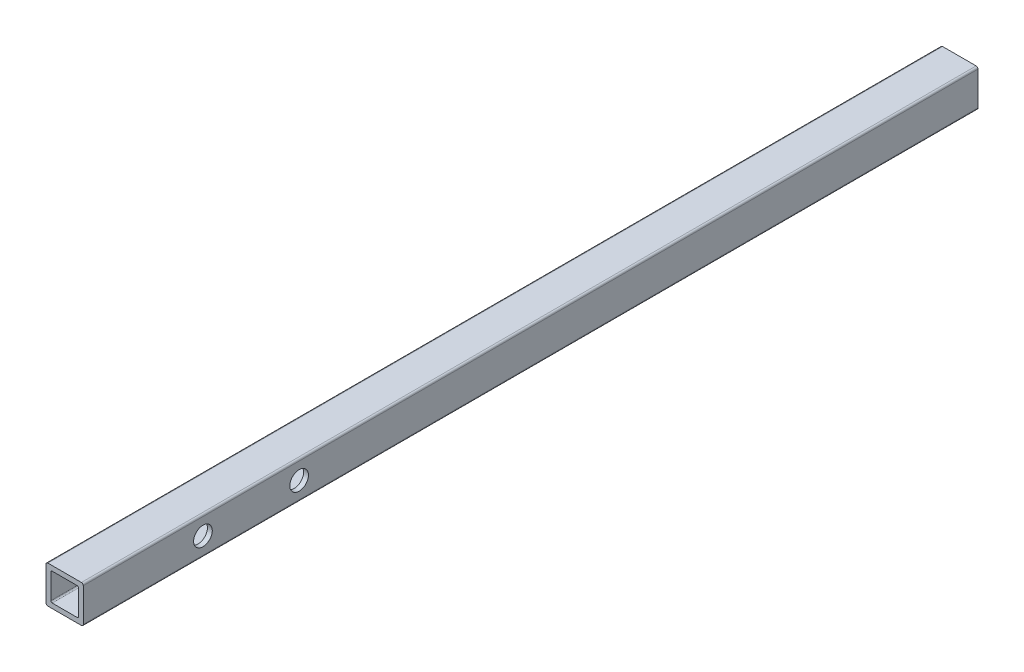
ISO-10303-21;
HEADER;
FILE_DESCRIPTION(('STEP AP214'),'2;1');
FILE_NAME('part.step','',(''),(''),'','','');
FILE_SCHEMA(('AUTOMOTIVE_DESIGN { 1 0 10303 214 1 1 1 1 }'));
ENDSEC;
DATA;
#1=APPLICATION_CONTEXT('core data for automotive mechanical design processes');
#2=APPLICATION_PROTOCOL_DEFINITION('international standard','automotive_design',2000,#1);
#3=PRODUCT_CONTEXT('',#1,'mechanical');
#4=PRODUCT('Part','Part','',(#3));
#5=PRODUCT_RELATED_PRODUCT_CATEGORY('part','',(#4));
#6=PRODUCT_DEFINITION_FORMATION('','',#4);
#7=PRODUCT_DEFINITION_CONTEXT('part definition',#1,'design');
#8=PRODUCT_DEFINITION('design','',#6,#7);
#9=PRODUCT_DEFINITION_SHAPE('','',#8);
#10=(LENGTH_UNIT() NAMED_UNIT(*) SI_UNIT(.MILLI.,.METRE.));
#11=(NAMED_UNIT(*) PLANE_ANGLE_UNIT() SI_UNIT($,.RADIAN.));
#12=(NAMED_UNIT(*) SI_UNIT($,.STERADIAN.) SOLID_ANGLE_UNIT());
#13=UNCERTAINTY_MEASURE_WITH_UNIT(LENGTH_MEASURE(1.E-05),#10,'distance_accuracy_value','');
#14=(GEOMETRIC_REPRESENTATION_CONTEXT(3) GLOBAL_UNCERTAINTY_ASSIGNED_CONTEXT((#13)) GLOBAL_UNIT_ASSIGNED_CONTEXT((#10,
#11,#12)) REPRESENTATION_CONTEXT('',''));
#15=CARTESIAN_POINT('',(0.,0.,0.));
#16=DIRECTION('',(0.,0.,1.));
#17=DIRECTION('',(1.,0.,0.));
#18=AXIS2_PLACEMENT_3D('',#15,#16,#17);
#19=CARTESIAN_POINT('',(5.71499999999997,-5.715,152.4));
#20=DIRECTION('',(0.,0.,1.));
#21=DIRECTION('',(1.,0.,0.));
#22=AXIS2_PLACEMENT_3D('',#19,#20,#21);
#23=PLANE('',#22);
#24=CARTESIAN_POINT('',(5.71499999999997,-5.715,152.4));
#25=DIRECTION('',(0.,0.,1.));
#26=DIRECTION('',(1.,0.,0.));
#27=AXIS2_PLACEMENT_3D('',#24,#25,#26);
#28=CIRCLE('',#27,0.634999999999999);
#29=CARTESIAN_POINT('',(5.71499999999997,-6.34999999999999,152.4));
#30=VERTEX_POINT('',#29);
#31=CARTESIAN_POINT('',(6.34999999999997,-5.715,152.4));
#32=VERTEX_POINT('',#31);
#33=EDGE_CURVE('E160',#30,#32,#28,.T.);
#34=ORIENTED_EDGE('',*,*,#33,.T.);
#35=DIRECTION('',(0.,1.,0.));
#36=VECTOR('',#35,1.);
#37=CARTESIAN_POINT('',(6.34999999999997,-5.715,152.4));
#38=LINE('',#37,#36);
#39=CARTESIAN_POINT('',(6.34999999999997,5.715,152.4));
#40=VERTEX_POINT('',#39);
#41=EDGE_CURVE('E248',#32,#40,#38,.T.);
#42=ORIENTED_EDGE('',*,*,#41,.T.);
#43=CARTESIAN_POINT('',(5.71499999999997,5.715,152.4));
#44=DIRECTION('',(0.,0.,1.));
#45=DIRECTION('',(1.,0.,0.));
#46=AXIS2_PLACEMENT_3D('',#43,#44,#45);
#47=CIRCLE('',#46,0.634999999999999);
#48=CARTESIAN_POINT('',(5.71499999999997,6.34999999999999,152.4));
#49=VERTEX_POINT('',#48);
#50=EDGE_CURVE('E250',#40,#49,#47,.T.);
#51=ORIENTED_EDGE('',*,*,#50,.T.);
#52=DIRECTION('',(-1.,0.,0.));
#53=VECTOR('',#52,1.);
#54=CARTESIAN_POINT('',(5.71499999999997,6.34999999999999,152.4));
#55=LINE('',#54,#53);
#56=CARTESIAN_POINT('',(-5.71500000000003,6.35000000000001,152.4));
#57=VERTEX_POINT('',#56);
#58=EDGE_CURVE('E252',#49,#57,#55,.T.);
#59=ORIENTED_EDGE('',*,*,#58,.T.);
#60=CARTESIAN_POINT('',(-5.71500000000003,5.715,152.4));
#61=DIRECTION('',(0.,0.,1.));
#62=DIRECTION('',(1.,0.,0.));
#63=AXIS2_PLACEMENT_3D('',#60,#61,#62);
#64=CIRCLE('',#63,0.635000000000003);
#65=CARTESIAN_POINT('',(-6.35000000000008,5.715,152.4));
#66=VERTEX_POINT('',#65);
#67=EDGE_CURVE('E254',#57,#66,#64,.T.);
#68=ORIENTED_EDGE('',*,*,#67,.T.);
#69=DIRECTION('',(0.,-1.,0.));
#70=VECTOR('',#69,1.);
#71=CARTESIAN_POINT('',(-6.35000000000008,-5.715,152.4));
#72=LINE('',#71,#70);
#73=CARTESIAN_POINT('',(-6.35000000000008,-5.715,152.4));
#74=VERTEX_POINT('',#73);
#75=EDGE_CURVE('E256',#66,#74,#72,.T.);
#76=ORIENTED_EDGE('',*,*,#75,.T.);
#77=CARTESIAN_POINT('',(-5.71500000000003,-5.715,152.4));
#78=DIRECTION('',(0.,0.,1.));
#79=DIRECTION('',(1.,0.,0.));
#80=AXIS2_PLACEMENT_3D('',#77,#78,#79);
#81=CIRCLE('',#80,0.635000000000003);
#82=CARTESIAN_POINT('',(-5.71500000000003,-6.34999999999999,152.4));
#83=VERTEX_POINT('',#82);
#84=EDGE_CURVE('E258',#74,#83,#81,.T.);
#85=ORIENTED_EDGE('',*,*,#84,.T.);
#86=DIRECTION('',(1.,0.,0.));
#87=VECTOR('',#86,1.);
#88=CARTESIAN_POINT('',(5.71499999999997,-6.34999999999999,152.4));
#89=LINE('',#88,#87);
#90=EDGE_CURVE('E59',#83,#30,#89,.T.);
#91=ORIENTED_EDGE('',*,*,#90,.T.);
#92=EDGE_LOOP('',(#34,#42,#51,#59,#68,#76,#85,#91));
#93=FACE_BOUND('',#92,.T.);
#94=DIRECTION('',(-1.,0.,0.));
#95=VECTOR('',#94,1.);
#96=CARTESIAN_POINT('',(4.22909999999999,4.69899999999999,152.4));
#97=LINE('',#96,#95);
#98=CARTESIAN_POINT('',(4.22909999999999,4.69899999999999,152.4));
#99=VERTEX_POINT('',#98);
#100=CARTESIAN_POINT('',(-4.22910000000004,4.69899999999999,152.4));
#101=VERTEX_POINT('',#100);
#102=EDGE_CURVE('E221',#99,#101,#97,.T.);
#103=ORIENTED_EDGE('',*,*,#102,.F.);
#104=CARTESIAN_POINT('',(4.22909999999999,4.2291,152.4));
#105=DIRECTION('',(0.,0.,1.));
#106=DIRECTION('',(1.,0.,0.));
#107=AXIS2_PLACEMENT_3D('',#104,#105,#106);
#108=CIRCLE('',#107,0.469899999999999);
#109=CARTESIAN_POINT('',(4.69899999999995,4.2291,152.4));
#110=VERTEX_POINT('',#109);
#111=EDGE_CURVE('E157',#110,#99,#108,.T.);
#112=ORIENTED_EDGE('',*,*,#111,.F.);
#113=DIRECTION('',(0.,1.,0.));
#114=VECTOR('',#113,1.);
#115=CARTESIAN_POINT('',(4.69899999999995,4.2291,152.4));
#116=LINE('',#115,#114);
#117=CARTESIAN_POINT('',(4.69899999999995,-4.2291,152.4));
#118=VERTEX_POINT('',#117);
#119=EDGE_CURVE('E233',#118,#110,#116,.T.);
#120=ORIENTED_EDGE('',*,*,#119,.F.);
#121=CARTESIAN_POINT('',(4.22909999999999,-4.2291,152.4));
#122=DIRECTION('',(0.,0.,1.));
#123=DIRECTION('',(1.,0.,0.));
#124=AXIS2_PLACEMENT_3D('',#121,#122,#123);
#125=CIRCLE('',#124,0.469899999999999);
#126=CARTESIAN_POINT('',(4.22909999999999,-4.69899999999999,152.4));
#127=VERTEX_POINT('',#126);
#128=EDGE_CURVE('E231',#127,#118,#125,.T.);
#129=ORIENTED_EDGE('',*,*,#128,.F.);
#130=DIRECTION('',(1.,0.,0.));
#131=VECTOR('',#130,1.);
#132=CARTESIAN_POINT('',(4.22909999999999,-4.69899999999999,152.4));
#133=LINE('',#132,#131);
#134=CARTESIAN_POINT('',(-4.22910000000004,-4.69899999999999,152.4));
#135=VERTEX_POINT('',#134);
#136=EDGE_CURVE('E229',#135,#127,#133,.T.);
#137=ORIENTED_EDGE('',*,*,#136,.F.);
#138=CARTESIAN_POINT('',(-4.22910000000004,-4.2291,152.4));
#139=DIRECTION('',(0.,0.,1.));
#140=DIRECTION('',(1.,0.,0.));
#141=AXIS2_PLACEMENT_3D('',#138,#139,#140);
#142=CIRCLE('',#141,0.4699);
#143=CARTESIAN_POINT('',(-4.69900000000001,-4.2291,152.4));
#144=VERTEX_POINT('',#143);
#145=EDGE_CURVE('E227',#144,#135,#142,.T.);
#146=ORIENTED_EDGE('',*,*,#145,.F.);
#147=DIRECTION('',(0.,-1.,0.));
#148=VECTOR('',#147,1.);
#149=CARTESIAN_POINT('',(-4.69900000000006,4.2291,152.4));
#150=LINE('',#149,#148);
#151=CARTESIAN_POINT('',(-4.69900000000006,4.2291,152.4));
#152=VERTEX_POINT('',#151);
#153=EDGE_CURVE('E225',#152,#144,#150,.T.);
#154=ORIENTED_EDGE('',*,*,#153,.F.);
#155=CARTESIAN_POINT('',(-4.22910000000004,4.2291,152.4));
#156=DIRECTION('',(0.,0.,1.));
#157=DIRECTION('',(1.,0.,0.));
#158=AXIS2_PLACEMENT_3D('',#155,#156,#157);
#159=CIRCLE('',#158,0.4699);
#160=EDGE_CURVE('E223',#101,#152,#159,.T.);
#161=ORIENTED_EDGE('',*,*,#160,.F.);
#162=EDGE_LOOP('',(#103,#112,#120,#129,#137,#146,#154,#161));
#163=FACE_BOUND('',#162,.T.);
#164=ADVANCED_FACE('F34',(#93,#163),#23,.T.);
#165=CARTESIAN_POINT('',(5.71499999999997,-5.715,152.4));
#166=DIRECTION('',(0.,0.,-1.));
#167=DIRECTION('',(-1.,0.,0.));
#168=AXIS2_PLACEMENT_3D('',#165,#166,#167);
#169=CYLINDRICAL_SURFACE('',#168,0.634999999999999);
#170=DIRECTION('',(0.,0.,-1.));
#171=VECTOR('',#170,1.);
#172=CARTESIAN_POINT('',(5.71499999999997,-6.34999999999999,152.4));
#173=LINE('',#172,#171);
#174=CARTESIAN_POINT('',(5.71500000000003,-6.34999999999997,-152.4));
#175=VERTEX_POINT('',#174);
#176=EDGE_CURVE('E261',#30,#175,#173,.T.);
#177=ORIENTED_EDGE('',*,*,#176,.T.);
#178=CARTESIAN_POINT('',(5.71500000000003,-5.71499999999997,-152.4));
#179=DIRECTION('',(0.,0.,1.));
#180=DIRECTION('',(1.,0.,0.));
#181=AXIS2_PLACEMENT_3D('',#178,#179,#180);
#182=CIRCLE('',#181,0.634999999999999);
#183=CARTESIAN_POINT('',(6.35000000000002,-5.71499999999997,-152.4));
#184=VERTEX_POINT('',#183);
#185=EDGE_CURVE('E196',#175,#184,#182,.T.);
#186=ORIENTED_EDGE('',*,*,#185,.T.);
#187=DIRECTION('',(0.,0.,-1.));
#188=VECTOR('',#187,1.);
#189=CARTESIAN_POINT('',(6.34999999999997,-5.715,152.4));
#190=LINE('',#189,#188);
#191=EDGE_CURVE('E11',#32,#184,#190,.T.);
#192=ORIENTED_EDGE('',*,*,#191,.F.);
#193=ORIENTED_EDGE('',*,*,#33,.F.);
#194=EDGE_LOOP('',(#177,#186,#192,#193));
#195=FACE_BOUND('',#194,.T.);
#196=ADVANCED_FACE('F36',(#195),#169,.T.);
#197=CARTESIAN_POINT('',(6.34999999999997,-5.715,152.4));
#198=DIRECTION('',(-1.,0.,0.));
#199=DIRECTION('',(0.,0.,1.));
#200=AXIS2_PLACEMENT_3D('',#197,#198,#199);
#201=PLANE('',#200);
#202=CARTESIAN_POINT('',(6.34999999999997,0.,78.8679589234109));
#203=DIRECTION('',(-1.,0.,0.));
#204=DIRECTION('',(0.,0.,1.));
#205=AXIS2_PLACEMENT_3D('',#202,#203,#204);
#206=CIRCLE('',#205,3.175);
#207=CARTESIAN_POINT('',(6.34999999999997,0.,82.0429589234109));
#208=VERTEX_POINT('',#207);
#209=EDGE_CURVE('E287',#208,#208,#206,.T.);
#210=ORIENTED_EDGE('',*,*,#209,.T.);
#211=EDGE_LOOP('',(#210));
#212=FACE_BOUND('',#211,.T.);
#213=CARTESIAN_POINT('',(6.34999999999997,0.,111.632041076589));
#214=DIRECTION('',(-1.,0.,0.));
#215=DIRECTION('',(0.,0.,1.));
#216=AXIS2_PLACEMENT_3D('',#213,#214,#215);
#217=CIRCLE('',#216,3.175);
#218=CARTESIAN_POINT('',(6.34999999999997,0.,114.807041076589));
#219=VERTEX_POINT('',#218);
#220=EDGE_CURVE('E274',#219,#219,#217,.T.);
#221=ORIENTED_EDGE('',*,*,#220,.T.);
#222=EDGE_LOOP('',(#221));
#223=FACE_BOUND('',#222,.T.);
#224=ORIENTED_EDGE('',*,*,#191,.T.);
#225=DIRECTION('',(0.,1.,0.));
#226=VECTOR('',#225,1.);
#227=CARTESIAN_POINT('',(6.35000000000002,-5.71499999999997,-152.4));
#228=LINE('',#227,#226);
#229=CARTESIAN_POINT('',(6.35000000000002,5.71500000000003,-152.4));
#230=VERTEX_POINT('',#229);
#231=EDGE_CURVE('E199',#184,#230,#228,.T.);
#232=ORIENTED_EDGE('',*,*,#231,.T.);
#233=DIRECTION('',(0.,0.,-1.));
#234=VECTOR('',#233,1.);
#235=CARTESIAN_POINT('',(6.34999999999997,5.715,152.4));
#236=LINE('',#235,#234);
#237=EDGE_CURVE('E43',#40,#230,#236,.T.);
#238=ORIENTED_EDGE('',*,*,#237,.F.);
#239=ORIENTED_EDGE('',*,*,#41,.F.);
#240=EDGE_LOOP('',(#224,#232,#238,#239));
#241=FACE_BOUND('',#240,.T.);
#242=ADVANCED_FACE('F327',(#212,#223,#241),#201,.F.);
#243=CARTESIAN_POINT('',(5.71499999999997,5.715,152.4));
#244=DIRECTION('',(0.,0.,-1.));
#245=DIRECTION('',(-1.,0.,0.));
#246=AXIS2_PLACEMENT_3D('',#243,#244,#245);
#247=CYLINDRICAL_SURFACE('',#246,0.634999999999999);
#248=ORIENTED_EDGE('',*,*,#237,.T.);
#249=CARTESIAN_POINT('',(5.71499999999997,5.71500000000003,-152.4));
#250=DIRECTION('',(0.,0.,1.));
#251=DIRECTION('',(1.,0.,0.));
#252=AXIS2_PLACEMENT_3D('',#249,#250,#251);
#253=CIRCLE('',#252,0.634999999999999);
#254=CARTESIAN_POINT('',(5.71499999999997,6.35000000000002,-152.4));
#255=VERTEX_POINT('',#254);
#256=EDGE_CURVE('E202',#230,#255,#253,.T.);
#257=ORIENTED_EDGE('',*,*,#256,.T.);
#258=DIRECTION('',(0.,0.,-1.));
#259=VECTOR('',#258,1.);
#260=CARTESIAN_POINT('',(5.71499999999997,6.34999999999999,152.4));
#261=LINE('',#260,#259);
#262=EDGE_CURVE('E271',#49,#255,#261,.T.);
#263=ORIENTED_EDGE('',*,*,#262,.F.);
#264=ORIENTED_EDGE('',*,*,#50,.F.);
#265=EDGE_LOOP('',(#248,#257,#263,#264));
#266=FACE_BOUND('',#265,.T.);
#267=ADVANCED_FACE('F323',(#266),#247,.T.);
#268=CARTESIAN_POINT('',(5.71499999999997,6.34999999999999,152.4));
#269=DIRECTION('',(0.,-1.,0.));
#270=DIRECTION('',(1.,0.,0.));
#271=AXIS2_PLACEMENT_3D('',#268,#269,#270);
#272=PLANE('',#271);
#273=ORIENTED_EDGE('',*,*,#262,.T.);
#274=DIRECTION('',(-1.,0.,0.));
#275=VECTOR('',#274,1.);
#276=CARTESIAN_POINT('',(5.71499999999997,6.35000000000002,-152.4));
#277=LINE('',#276,#275);
#278=CARTESIAN_POINT('',(-5.71500000000003,6.35000000000002,-152.4));
#279=VERTEX_POINT('',#278);
#280=EDGE_CURVE('E205',#255,#279,#277,.T.);
#281=ORIENTED_EDGE('',*,*,#280,.T.);
#282=DIRECTION('',(0.,0.,-1.));
#283=VECTOR('',#282,1.);
#284=CARTESIAN_POINT('',(-5.71500000000003,6.35000000000001,152.4));
#285=LINE('',#284,#283);
#286=EDGE_CURVE('E269',#57,#279,#285,.T.);
#287=ORIENTED_EDGE('',*,*,#286,.F.);
#288=ORIENTED_EDGE('',*,*,#58,.F.);
#289=EDGE_LOOP('',(#273,#281,#287,#288));
#290=FACE_BOUND('',#289,.T.);
#291=ADVANCED_FACE('F318',(#290),#272,.F.);
#292=CARTESIAN_POINT('',(-5.71500000000003,5.715,152.4));
#293=DIRECTION('',(0.,0.,-1.));
#294=DIRECTION('',(-1.,0.,0.));
#295=AXIS2_PLACEMENT_3D('',#292,#293,#294);
#296=CYLINDRICAL_SURFACE('',#295,0.635000000000003);
#297=ORIENTED_EDGE('',*,*,#286,.T.);
#298=CARTESIAN_POINT('',(-5.71500000000003,5.71500000000003,-152.4));
#299=DIRECTION('',(0.,0.,1.));
#300=DIRECTION('',(1.,0.,0.));
#301=AXIS2_PLACEMENT_3D('',#298,#299,#300);
#302=CIRCLE('',#301,0.635000000000003);
#303=CARTESIAN_POINT('',(-6.35000000000002,5.71500000000003,-152.4));
#304=VERTEX_POINT('',#303);
#305=EDGE_CURVE('E208',#279,#304,#302,.T.);
#306=ORIENTED_EDGE('',*,*,#305,.T.);
#307=DIRECTION('',(0.,0.,-1.));
#308=VECTOR('',#307,1.);
#309=CARTESIAN_POINT('',(-6.35000000000008,5.715,152.4));
#310=LINE('',#309,#308);
#311=EDGE_CURVE('E267',#66,#304,#310,.T.);
#312=ORIENTED_EDGE('',*,*,#311,.F.);
#313=ORIENTED_EDGE('',*,*,#67,.F.);
#314=EDGE_LOOP('',(#297,#306,#312,#313));
#315=FACE_BOUND('',#314,.T.);
#316=ADVANCED_FACE('F300',(#315),#296,.T.);
#317=CARTESIAN_POINT('',(-6.35000000000008,-5.715,152.4));
#318=DIRECTION('',(1.,0.,0.));
#319=DIRECTION('',(0.,0.,-1.));
#320=AXIS2_PLACEMENT_3D('',#317,#318,#319);
#321=PLANE('',#320);
#322=CARTESIAN_POINT('',(-6.35000000000008,0.,78.8679589234109));
#323=DIRECTION('',(-1.,0.,0.));
#324=DIRECTION('',(0.,0.,1.));
#325=AXIS2_PLACEMENT_3D('',#322,#323,#324);
#326=CIRCLE('',#325,3.175);
#327=CARTESIAN_POINT('',(-6.35000000000008,0.,82.0429589234109));
#328=VERTEX_POINT('',#327);
#329=EDGE_CURVE('E290',#328,#328,#326,.T.);
#330=ORIENTED_EDGE('',*,*,#329,.F.);
#331=EDGE_LOOP('',(#330));
#332=FACE_BOUND('',#331,.T.);
#333=CARTESIAN_POINT('',(-6.35000000000008,0.,111.632041076589));
#334=DIRECTION('',(-1.,0.,0.));
#335=DIRECTION('',(0.,0.,1.));
#336=AXIS2_PLACEMENT_3D('',#333,#334,#335);
#337=CIRCLE('',#336,3.175);
#338=CARTESIAN_POINT('',(-6.35000000000008,0.,114.807041076589));
#339=VERTEX_POINT('',#338);
#340=EDGE_CURVE('E278',#339,#339,#337,.T.);
#341=ORIENTED_EDGE('',*,*,#340,.F.);
#342=EDGE_LOOP('',(#341));
#343=FACE_BOUND('',#342,.T.);
#344=ORIENTED_EDGE('',*,*,#311,.T.);
#345=DIRECTION('',(0.,-1.,0.));
#346=VECTOR('',#345,1.);
#347=CARTESIAN_POINT('',(-6.35000000000002,-5.71499999999997,-152.4));
#348=LINE('',#347,#346);
#349=CARTESIAN_POINT('',(-6.35000000000002,-5.71499999999997,-152.4));
#350=VERTEX_POINT('',#349);
#351=EDGE_CURVE('E211',#304,#350,#348,.T.);
#352=ORIENTED_EDGE('',*,*,#351,.T.);
#353=DIRECTION('',(0.,0.,-1.));
#354=VECTOR('',#353,1.);
#355=CARTESIAN_POINT('',(-6.35000000000008,-5.715,152.4));
#356=LINE('',#355,#354);
#357=EDGE_CURVE('E265',#74,#350,#356,.T.);
#358=ORIENTED_EDGE('',*,*,#357,.F.);
#359=ORIENTED_EDGE('',*,*,#75,.F.);
#360=EDGE_LOOP('',(#344,#352,#358,#359));
#361=FACE_BOUND('',#360,.T.);
#362=ADVANCED_FACE('F296',(#332,#343,#361),#321,.F.);
#363=CARTESIAN_POINT('',(-5.71500000000003,-5.715,152.4));
#364=DIRECTION('',(0.,0.,-1.));
#365=DIRECTION('',(-1.,0.,0.));
#366=AXIS2_PLACEMENT_3D('',#363,#364,#365);
#367=CYLINDRICAL_SURFACE('',#366,0.635000000000003);
#368=ORIENTED_EDGE('',*,*,#357,.T.);
#369=CARTESIAN_POINT('',(-5.71499999999997,-5.71499999999997,-152.4));
#370=DIRECTION('',(0.,0.,1.));
#371=DIRECTION('',(1.,0.,0.));
#372=AXIS2_PLACEMENT_3D('',#369,#370,#371);
#373=CIRCLE('',#372,0.635000000000003);
#374=CARTESIAN_POINT('',(-5.71499999999997,-6.34999999999998,-152.4));
#375=VERTEX_POINT('',#374);
#376=EDGE_CURVE('E214',#350,#375,#373,.T.);
#377=ORIENTED_EDGE('',*,*,#376,.T.);
#378=DIRECTION('',(0.,0.,-1.));
#379=VECTOR('',#378,1.);
#380=CARTESIAN_POINT('',(-5.71500000000003,-6.34999999999999,152.4));
#381=LINE('',#380,#379);
#382=EDGE_CURVE('E263',#83,#375,#381,.T.);
#383=ORIENTED_EDGE('',*,*,#382,.F.);
#384=ORIENTED_EDGE('',*,*,#84,.F.);
#385=EDGE_LOOP('',(#368,#377,#383,#384));
#386=FACE_BOUND('',#385,.T.);
#387=ADVANCED_FACE('F299',(#386),#367,.T.);
#388=CARTESIAN_POINT('',(5.71499999999997,-6.34999999999999,152.4));
#389=DIRECTION('',(0.,1.,0.));
#390=DIRECTION('',(-1.,0.,0.));
#391=AXIS2_PLACEMENT_3D('',#388,#389,#390);
#392=PLANE('',#391);
#393=ORIENTED_EDGE('',*,*,#382,.T.);
#394=DIRECTION('',(1.,0.,0.));
#395=VECTOR('',#394,1.);
#396=CARTESIAN_POINT('',(5.71500000000003,-6.34999999999997,-152.4));
#397=LINE('',#396,#395);
#398=EDGE_CURVE('E217',#375,#175,#397,.T.);
#399=ORIENTED_EDGE('',*,*,#398,.T.);
#400=ORIENTED_EDGE('',*,*,#176,.F.);
#401=ORIENTED_EDGE('',*,*,#90,.F.);
#402=EDGE_LOOP('',(#393,#399,#400,#401));
#403=FACE_BOUND('',#402,.T.);
#404=ADVANCED_FACE('F332',(#403),#392,.F.);
#405=CARTESIAN_POINT('',(4.22909999999999,4.2291,152.4));
#406=DIRECTION('',(0.,0.,-1.));
#407=DIRECTION('',(-1.,0.,0.));
#408=AXIS2_PLACEMENT_3D('',#405,#406,#407);
#409=CYLINDRICAL_SURFACE('',#408,0.469899999999999);
#410=DIRECTION('',(0.,0.,-1.));
#411=VECTOR('',#410,1.);
#412=CARTESIAN_POINT('',(4.22909999999999,4.69899999999999,152.4));
#413=LINE('',#412,#411);
#414=CARTESIAN_POINT('',(4.22910000000004,4.69900000000002,-152.4));
#415=VERTEX_POINT('',#414);
#416=EDGE_CURVE('E149',#99,#415,#413,.T.);
#417=ORIENTED_EDGE('',*,*,#416,.T.);
#418=CARTESIAN_POINT('',(4.22910000000004,4.22910000000003,-152.4));
#419=DIRECTION('',(0.,0.,1.));
#420=DIRECTION('',(1.,0.,0.));
#421=AXIS2_PLACEMENT_3D('',#418,#419,#420);
#422=CIRCLE('',#421,0.469899999999999);
#423=CARTESIAN_POINT('',(4.69900000000001,4.22910000000003,-152.4));
#424=VERTEX_POINT('',#423);
#425=EDGE_CURVE('E154',#424,#415,#422,.T.);
#426=ORIENTED_EDGE('',*,*,#425,.F.);
#427=DIRECTION('',(0.,0.,-1.));
#428=VECTOR('',#427,1.);
#429=CARTESIAN_POINT('',(4.69899999999995,4.2291,152.4));
#430=LINE('',#429,#428);
#431=EDGE_CURVE('E235',#110,#424,#430,.T.);
#432=ORIENTED_EDGE('',*,*,#431,.F.);
#433=ORIENTED_EDGE('',*,*,#111,.T.);
#434=EDGE_LOOP('',(#417,#426,#432,#433));
#435=FACE_BOUND('',#434,.T.);
#436=ADVANCED_FACE('F151',(#435),#409,.F.);
#437=CARTESIAN_POINT('',(4.22909999999999,4.69899999999999,152.4));
#438=DIRECTION('',(0.,-1.,0.));
#439=DIRECTION('',(0.,0.,-1.));
#440=AXIS2_PLACEMENT_3D('',#437,#438,#439);
#441=PLANE('',#440);
#442=DIRECTION('',(0.,0.,-1.));
#443=VECTOR('',#442,1.);
#444=CARTESIAN_POINT('',(-4.22910000000004,4.69899999999999,152.4));
#445=LINE('',#444,#443);
#446=CARTESIAN_POINT('',(-4.22909999999999,4.69900000000002,-152.4));
#447=VERTEX_POINT('',#446);
#448=EDGE_CURVE('E161',#101,#447,#445,.T.);
#449=ORIENTED_EDGE('',*,*,#448,.T.);
#450=DIRECTION('',(-1.,0.,0.));
#451=VECTOR('',#450,1.);
#452=CARTESIAN_POINT('',(4.22910000000004,4.69900000000002,-152.4));
#453=LINE('',#452,#451);
#454=EDGE_CURVE('E164',#415,#447,#453,.T.);
#455=ORIENTED_EDGE('',*,*,#454,.F.);
#456=ORIENTED_EDGE('',*,*,#416,.F.);
#457=ORIENTED_EDGE('',*,*,#102,.T.);
#458=EDGE_LOOP('',(#449,#455,#456,#457));
#459=FACE_BOUND('',#458,.T.);
#460=ADVANCED_FACE('F165',(#459),#441,.T.);
#461=CARTESIAN_POINT('',(-4.22910000000004,4.2291,152.4));
#462=DIRECTION('',(0.,0.,-1.));
#463=DIRECTION('',(-1.,0.,0.));
#464=AXIS2_PLACEMENT_3D('',#461,#462,#463);
#465=CYLINDRICAL_SURFACE('',#464,0.4699);
#466=DIRECTION('',(0.,0.,-1.));
#467=VECTOR('',#466,1.);
#468=CARTESIAN_POINT('',(-4.69900000000006,4.2291,152.4));
#469=LINE('',#468,#467);
#470=CARTESIAN_POINT('',(-4.69900000000001,4.22910000000003,-152.4));
#471=VERTEX_POINT('',#470);
#472=EDGE_CURVE('E244',#152,#471,#469,.T.);
#473=ORIENTED_EDGE('',*,*,#472,.T.);
#474=CARTESIAN_POINT('',(-4.22909999999999,4.22910000000003,-152.4));
#475=DIRECTION('',(0.,0.,1.));
#476=DIRECTION('',(1.,0.,0.));
#477=AXIS2_PLACEMENT_3D('',#474,#475,#476);
#478=CIRCLE('',#477,0.4699);
#479=EDGE_CURVE('E170',#447,#471,#478,.T.);
#480=ORIENTED_EDGE('',*,*,#479,.F.);
#481=ORIENTED_EDGE('',*,*,#448,.F.);
#482=ORIENTED_EDGE('',*,*,#160,.T.);
#483=EDGE_LOOP('',(#473,#480,#481,#482));
#484=FACE_BOUND('',#483,.T.);
#485=ADVANCED_FACE('F343',(#484),#465,.F.);
#486=CARTESIAN_POINT('',(-4.69900000000006,4.2291,152.4));
#487=DIRECTION('',(1.,0.,0.));
#488=DIRECTION('',(0.,1.,0.));
#489=AXIS2_PLACEMENT_3D('',#486,#487,#488);
#490=PLANE('',#489);
#491=CARTESIAN_POINT('',(-4.69900000000006,0.,78.8679589234109));
#492=DIRECTION('',(1.,0.,0.));
#493=DIRECTION('',(0.,1.,0.));
#494=AXIS2_PLACEMENT_3D('',#491,#492,#493);
#495=CIRCLE('',#494,3.175);
#496=CARTESIAN_POINT('',(-4.69900000000006,3.175,78.8679589234109));
#497=VERTEX_POINT('',#496);
#498=EDGE_CURVE('E38',#497,#497,#495,.T.);
#499=ORIENTED_EDGE('',*,*,#498,.F.);
#500=EDGE_LOOP('',(#499));
#501=FACE_BOUND('',#500,.T.);
#502=CARTESIAN_POINT('',(-4.69900000000006,0.,111.632041076589));
#503=DIRECTION('',(1.,0.,0.));
#504=DIRECTION('',(0.,1.,0.));
#505=AXIS2_PLACEMENT_3D('',#502,#503,#504);
#506=CIRCLE('',#505,3.175);
#507=CARTESIAN_POINT('',(-4.69900000000006,3.17500000000003,111.632041076589));
#508=VERTEX_POINT('',#507);
#509=EDGE_CURVE('E179',#508,#508,#506,.T.);
#510=ORIENTED_EDGE('',*,*,#509,.F.);
#511=EDGE_LOOP('',(#510));
#512=FACE_BOUND('',#511,.T.);
#513=DIRECTION('',(0.,0.,-1.));
#514=VECTOR('',#513,1.);
#515=CARTESIAN_POINT('',(-4.69900000000001,-4.2291,152.4));
#516=LINE('',#515,#514);
#517=CARTESIAN_POINT('',(-4.69899999999995,-4.22909999999997,-152.4));
#518=VERTEX_POINT('',#517);
#519=EDGE_CURVE('E242',#144,#518,#516,.T.);
#520=ORIENTED_EDGE('',*,*,#519,.T.);
#521=DIRECTION('',(0.,-1.,0.));
#522=VECTOR('',#521,1.);
#523=CARTESIAN_POINT('',(-4.69900000000001,4.22910000000003,-152.4));
#524=LINE('',#523,#522);
#525=EDGE_CURVE('E184',#471,#518,#524,.T.);
#526=ORIENTED_EDGE('',*,*,#525,.F.);
#527=ORIENTED_EDGE('',*,*,#472,.F.);
#528=ORIENTED_EDGE('',*,*,#153,.T.);
#529=EDGE_LOOP('',(#520,#526,#527,#528));
#530=FACE_BOUND('',#529,.T.);
#531=ADVANCED_FACE('F348',(#501,#512,#530),#490,.T.);
#532=CARTESIAN_POINT('',(-4.22910000000004,-4.2291,152.4));
#533=DIRECTION('',(0.,0.,-1.));
#534=DIRECTION('',(-1.,0.,0.));
#535=AXIS2_PLACEMENT_3D('',#532,#533,#534);
#536=CYLINDRICAL_SURFACE('',#535,0.4699);
#537=DIRECTION('',(0.,0.,-1.));
#538=VECTOR('',#537,1.);
#539=CARTESIAN_POINT('',(-4.22910000000004,-4.69899999999999,152.4));
#540=LINE('',#539,#538);
#541=CARTESIAN_POINT('',(-4.22909999999999,-4.69899999999998,-152.4));
#542=VERTEX_POINT('',#541);
#543=EDGE_CURVE('E240',#135,#542,#540,.T.);
#544=ORIENTED_EDGE('',*,*,#543,.T.);
#545=CARTESIAN_POINT('',(-4.22909999999999,-4.22909999999997,-152.4));
#546=DIRECTION('',(0.,0.,1.));
#547=DIRECTION('',(1.,0.,0.));
#548=AXIS2_PLACEMENT_3D('',#545,#546,#547);
#549=CIRCLE('',#548,0.4699);
#550=EDGE_CURVE('E187',#518,#542,#549,.T.);
#551=ORIENTED_EDGE('',*,*,#550,.F.);
#552=ORIENTED_EDGE('',*,*,#519,.F.);
#553=ORIENTED_EDGE('',*,*,#145,.T.);
#554=EDGE_LOOP('',(#544,#551,#552,#553));
#555=FACE_BOUND('',#554,.T.);
#556=ADVANCED_FACE('F352',(#555),#536,.F.);
#557=CARTESIAN_POINT('',(4.22909999999999,-4.69899999999999,152.4));
#558=DIRECTION('',(0.,1.,0.));
#559=DIRECTION('',(-1.,0.,0.));
#560=AXIS2_PLACEMENT_3D('',#557,#558,#559);
#561=PLANE('',#560);
#562=DIRECTION('',(0.,0.,-1.));
#563=VECTOR('',#562,1.);
#564=CARTESIAN_POINT('',(4.22909999999999,-4.69899999999999,152.4));
#565=LINE('',#564,#563);
#566=CARTESIAN_POINT('',(4.22910000000004,-4.69899999999997,-152.4));
#567=VERTEX_POINT('',#566);
#568=EDGE_CURVE('E238',#127,#567,#565,.T.);
#569=ORIENTED_EDGE('',*,*,#568,.T.);
#570=DIRECTION('',(1.,0.,0.));
#571=VECTOR('',#570,1.);
#572=CARTESIAN_POINT('',(4.22910000000004,-4.69899999999997,-152.4));
#573=LINE('',#572,#571);
#574=EDGE_CURVE('E190',#542,#567,#573,.T.);
#575=ORIENTED_EDGE('',*,*,#574,.F.);
#576=ORIENTED_EDGE('',*,*,#543,.F.);
#577=ORIENTED_EDGE('',*,*,#136,.T.);
#578=EDGE_LOOP('',(#569,#575,#576,#577));
#579=FACE_BOUND('',#578,.T.);
#580=ADVANCED_FACE('F357',(#579),#561,.T.);
#581=CARTESIAN_POINT('',(4.22909999999999,-4.2291,152.4));
#582=DIRECTION('',(0.,0.,-1.));
#583=DIRECTION('',(-1.,0.,0.));
#584=AXIS2_PLACEMENT_3D('',#581,#582,#583);
#585=CYLINDRICAL_SURFACE('',#584,0.469899999999999);
#586=DIRECTION('',(0.,0.,-1.));
#587=VECTOR('',#586,1.);
#588=CARTESIAN_POINT('',(4.69899999999995,-4.2291,152.4));
#589=LINE('',#588,#587);
#590=CARTESIAN_POINT('',(4.69900000000001,-4.22909999999997,-152.4));
#591=VERTEX_POINT('',#590);
#592=EDGE_CURVE('E51',#118,#591,#589,.T.);
#593=ORIENTED_EDGE('',*,*,#592,.T.);
#594=CARTESIAN_POINT('',(4.22910000000004,-4.22909999999997,-152.4));
#595=DIRECTION('',(0.,0.,1.));
#596=DIRECTION('',(1.,0.,0.));
#597=AXIS2_PLACEMENT_3D('',#594,#595,#596);
#598=CIRCLE('',#597,0.469899999999999);
#599=EDGE_CURVE('E193',#567,#591,#598,.T.);
#600=ORIENTED_EDGE('',*,*,#599,.F.);
#601=ORIENTED_EDGE('',*,*,#568,.F.);
#602=ORIENTED_EDGE('',*,*,#128,.T.);
#603=EDGE_LOOP('',(#593,#600,#601,#602));
#604=FACE_BOUND('',#603,.T.);
#605=ADVANCED_FACE('F361',(#604),#585,.F.);
#606=CARTESIAN_POINT('',(4.69899999999995,4.2291,152.4));
#607=DIRECTION('',(-1.,0.,0.));
#608=DIRECTION('',(0.,0.,1.));
#609=AXIS2_PLACEMENT_3D('',#606,#607,#608);
#610=PLANE('',#609);
#611=CARTESIAN_POINT('',(4.69899999999995,0.,78.8679589234109));
#612=DIRECTION('',(-1.,0.,0.));
#613=DIRECTION('',(0.,0.,1.));
#614=AXIS2_PLACEMENT_3D('',#611,#612,#613);
#615=CIRCLE('',#614,3.175);
#616=CARTESIAN_POINT('',(4.69899999999995,0.,82.0429589234109));
#617=VERTEX_POINT('',#616);
#618=EDGE_CURVE('E282',#617,#617,#615,.T.);
#619=ORIENTED_EDGE('',*,*,#618,.F.);
#620=EDGE_LOOP('',(#619));
#621=FACE_BOUND('',#620,.T.);
#622=CARTESIAN_POINT('',(4.69899999999995,0.,111.632041076589));
#623=DIRECTION('',(-1.,0.,0.));
#624=DIRECTION('',(0.,0.,1.));
#625=AXIS2_PLACEMENT_3D('',#622,#623,#624);
#626=CIRCLE('',#625,3.175);
#627=CARTESIAN_POINT('',(4.69899999999995,0.,114.807041076589));
#628=VERTEX_POINT('',#627);
#629=EDGE_CURVE('E176',#628,#628,#626,.T.);
#630=ORIENTED_EDGE('',*,*,#629,.F.);
#631=EDGE_LOOP('',(#630));
#632=FACE_BOUND('',#631,.T.);
#633=ORIENTED_EDGE('',*,*,#431,.T.);
#634=DIRECTION('',(0.,1.,0.));
#635=VECTOR('',#634,1.);
#636=CARTESIAN_POINT('',(4.69900000000001,4.22910000000003,-152.4));
#637=LINE('',#636,#635);
#638=EDGE_CURVE('E175',#591,#424,#637,.T.);
#639=ORIENTED_EDGE('',*,*,#638,.F.);
#640=ORIENTED_EDGE('',*,*,#592,.F.);
#641=ORIENTED_EDGE('',*,*,#119,.T.);
#642=EDGE_LOOP('',(#633,#639,#640,#641));
#643=FACE_BOUND('',#642,.T.);
#644=ADVANCED_FACE('F363',(#621,#632,#643),#610,.T.);
#645=CARTESIAN_POINT('',(5.71500000000003,-5.71499999999997,-152.4));
#646=DIRECTION('',(0.,0.,1.));
#647=DIRECTION('',(1.,0.,0.));
#648=AXIS2_PLACEMENT_3D('',#645,#646,#647);
#649=PLANE('',#648);
#650=ORIENTED_EDGE('',*,*,#638,.T.);
#651=ORIENTED_EDGE('',*,*,#425,.T.);
#652=ORIENTED_EDGE('',*,*,#454,.T.);
#653=ORIENTED_EDGE('',*,*,#479,.T.);
#654=ORIENTED_EDGE('',*,*,#525,.T.);
#655=ORIENTED_EDGE('',*,*,#550,.T.);
#656=ORIENTED_EDGE('',*,*,#574,.T.);
#657=ORIENTED_EDGE('',*,*,#599,.T.);
#658=EDGE_LOOP('',(#650,#651,#652,#653,#654,#655,#656,#657));
#659=FACE_BOUND('',#658,.T.);
#660=ORIENTED_EDGE('',*,*,#185,.F.);
#661=ORIENTED_EDGE('',*,*,#398,.F.);
#662=ORIENTED_EDGE('',*,*,#376,.F.);
#663=ORIENTED_EDGE('',*,*,#351,.F.);
#664=ORIENTED_EDGE('',*,*,#305,.F.);
#665=ORIENTED_EDGE('',*,*,#280,.F.);
#666=ORIENTED_EDGE('',*,*,#256,.F.);
#667=ORIENTED_EDGE('',*,*,#231,.F.);
#668=EDGE_LOOP('',(#660,#661,#662,#663,#664,#665,#666,#667));
#669=FACE_BOUND('',#668,.T.);
#670=ADVANCED_FACE('F172',(#659,#669),#649,.F.);
#671=CARTESIAN_POINT('',(-6.35000000000008,0.,111.632041076589));
#672=DIRECTION('',(-1.,0.,0.));
#673=DIRECTION('',(0.,0.,1.));
#674=AXIS2_PLACEMENT_3D('',#671,#672,#673);
#675=CYLINDRICAL_SURFACE('',#674,3.175);
#676=ORIENTED_EDGE('',*,*,#509,.T.);
#677=EDGE_LOOP('',(#676));
#678=FACE_BOUND('',#677,.T.);
#679=ORIENTED_EDGE('',*,*,#340,.T.);
#680=EDGE_LOOP('',(#679));
#681=FACE_BOUND('',#680,.T.);
#682=ADVANCED_FACE('F371',(#678,#681),#675,.F.);
#683=ORIENTED_EDGE('',*,*,#629,.T.);
#684=EDGE_LOOP('',(#683));
#685=FACE_BOUND('',#684,.T.);
#686=ORIENTED_EDGE('',*,*,#220,.F.);
#687=EDGE_LOOP('',(#686));
#688=FACE_BOUND('',#687,.T.);
#689=ADVANCED_FACE('F414',(#685,#688),#675,.F.);
#690=CARTESIAN_POINT('',(-6.35000000000008,0.,78.8679589234109));
#691=DIRECTION('',(-1.,0.,0.));
#692=DIRECTION('',(0.,0.,1.));
#693=AXIS2_PLACEMENT_3D('',#690,#691,#692);
#694=CYLINDRICAL_SURFACE('',#693,3.175);
#695=ORIENTED_EDGE('',*,*,#498,.T.);
#696=EDGE_LOOP('',(#695));
#697=FACE_BOUND('',#696,.T.);
#698=ORIENTED_EDGE('',*,*,#329,.T.);
#699=EDGE_LOOP('',(#698));
#700=FACE_BOUND('',#699,.T.);
#701=ADVANCED_FACE('F294',(#697,#700),#694,.F.);
#702=ORIENTED_EDGE('',*,*,#618,.T.);
#703=EDGE_LOOP('',(#702));
#704=FACE_BOUND('',#703,.T.);
#705=ORIENTED_EDGE('',*,*,#209,.F.);
#706=EDGE_LOOP('',(#705));
#707=FACE_BOUND('',#706,.T.);
#708=ADVANCED_FACE('F407',(#704,#707),#694,.F.);
#709=CLOSED_SHELL('',(#164,#196,#242,#267,#291,#316,#362,#387,#404,#436,#460,#485,#531,#556,
#580,#605,#644,#670,#682,#689,#701,#708));
#710=MANIFOLD_SOLID_BREP('B2',#709);
#711=ADVANCED_BREP_SHAPE_REPRESENTATION('',(#18,#710),#14);
#712=SHAPE_DEFINITION_REPRESENTATION(#9,#711);
ENDSEC;
END-ISO-10303-21;
